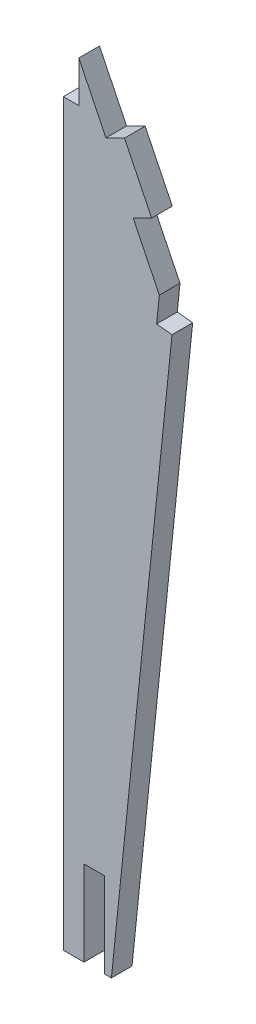
ISO-10303-21;
HEADER;
FILE_DESCRIPTION(('STEP AP214'),'2;1');
FILE_NAME('part.step','',(''),(''),'','','');
FILE_SCHEMA(('AUTOMOTIVE_DESIGN { 1 0 10303 214 1 1 1 1 }'));
ENDSEC;
DATA;
#1=APPLICATION_CONTEXT('core data for automotive mechanical design processes');
#2=APPLICATION_PROTOCOL_DEFINITION('international standard','automotive_design',2000,#1);
#3=PRODUCT_CONTEXT('',#1,'mechanical');
#4=PRODUCT('Part','Part','',(#3));
#5=PRODUCT_RELATED_PRODUCT_CATEGORY('part','',(#4));
#6=PRODUCT_DEFINITION_FORMATION('','',#4);
#7=PRODUCT_DEFINITION_CONTEXT('part definition',#1,'design');
#8=PRODUCT_DEFINITION('design','',#6,#7);
#9=PRODUCT_DEFINITION_SHAPE('','',#8);
#10=(LENGTH_UNIT() NAMED_UNIT(*) SI_UNIT(.MILLI.,.METRE.));
#11=(NAMED_UNIT(*) PLANE_ANGLE_UNIT() SI_UNIT($,.RADIAN.));
#12=(NAMED_UNIT(*) SI_UNIT($,.STERADIAN.) SOLID_ANGLE_UNIT());
#13=UNCERTAINTY_MEASURE_WITH_UNIT(LENGTH_MEASURE(1.E-05),#10,'distance_accuracy_value','');
#14=(GEOMETRIC_REPRESENTATION_CONTEXT(3) GLOBAL_UNCERTAINTY_ASSIGNED_CONTEXT((#13)) GLOBAL_UNIT_ASSIGNED_CONTEXT((#10,
#11,#12)) REPRESENTATION_CONTEXT('',''));
#15=CARTESIAN_POINT('',(0.,0.,0.));
#16=DIRECTION('',(0.,0.,1.));
#17=DIRECTION('',(1.,0.,0.));
#18=AXIS2_PLACEMENT_3D('',#15,#16,#17);
#19=CARTESIAN_POINT('',(6.4460614654401,62.4417438594003,2.));
#20=DIRECTION('',(0.102687481920299,0.994713667874765,0.));
#21=DIRECTION('',(-0.994713667874765,0.102687481920299,0.));
#22=AXIS2_PLACEMENT_3D('',#19,#20,#21);
#23=PLANE('',#22);
#24=DIRECTION('',(0.994713667874765,-0.102687481920299,0.));
#25=VECTOR('',#24,1.);
#26=CARTESIAN_POINT('',(6.4460614654401,62.4417438594003,0.));
#27=LINE('',#26,#25);
#28=CARTESIAN_POINT('',(18.4976497469624,61.1976197523959,0.));
#29=VERTEX_POINT('',#28);
#30=CARTESIAN_POINT('',(19.9897202487737,61.0435885295156,0.));
#31=VERTEX_POINT('',#30);
#32=EDGE_CURVE('E178',#29,#31,#27,.T.);
#33=ORIENTED_EDGE('',*,*,#32,.F.);
#34=DIRECTION('',(0.,0.,-1.));
#35=VECTOR('',#34,1.);
#36=CARTESIAN_POINT('',(18.4976497469624,61.1976197523959,2.));
#37=LINE('',#36,#35);
#38=CARTESIAN_POINT('',(18.4976497469624,61.1976197523959,2.));
#39=VERTEX_POINT('',#38);
#40=EDGE_CURVE('E11',#39,#29,#37,.T.);
#41=ORIENTED_EDGE('',*,*,#40,.F.);
#42=DIRECTION('',(0.994713667874765,-0.102687481920299,0.));
#43=VECTOR('',#42,1.);
#44=CARTESIAN_POINT('',(6.4460614654401,62.4417438594003,2.));
#45=LINE('',#44,#43);
#46=CARTESIAN_POINT('',(19.9897202487737,61.0435885295156,2.));
#47=VERTEX_POINT('',#46);
#48=EDGE_CURVE('E216',#39,#47,#45,.T.);
#49=ORIENTED_EDGE('',*,*,#48,.T.);
#50=DIRECTION('',(0.,0.,-1.));
#51=VECTOR('',#50,1.);
#52=CARTESIAN_POINT('',(19.9897202487737,61.0435885295156,2.));
#53=LINE('',#52,#51);
#54=EDGE_CURVE('E53',#47,#31,#53,.T.);
#55=ORIENTED_EDGE('',*,*,#54,.T.);
#56=EDGE_LOOP('',(#33,#41,#49,#55));
#57=FACE_BOUND('',#56,.T.);
#58=ADVANCED_FACE('F37',(#57),#23,.T.);
#59=CARTESIAN_POINT('',(12.0515882815053,-1.24412410700585,2.));
#60=DIRECTION('',(0.994713667874737,-0.102687481920566,0.));
#61=DIRECTION('',(0.102687481920566,0.994713667874737,0.));
#62=AXIS2_PLACEMENT_3D('',#59,#60,#61);
#63=PLANE('',#62);
#64=DIRECTION('',(-0.102687481920566,-0.994713667874737,0.));
#65=VECTOR('',#64,1.);
#66=CARTESIAN_POINT('',(12.0515882815053,-1.24412410700585,0.));
#67=LINE('',#66,#65);
#68=CARTESIAN_POINT('',(18.76120251057,63.750604120728,0.));
#69=VERTEX_POINT('',#68);
#70=EDGE_CURVE('E180',#69,#29,#67,.T.);
#71=ORIENTED_EDGE('',*,*,#70,.F.);
#72=DIRECTION('',(0.,0.,-1.));
#73=VECTOR('',#72,1.);
#74=CARTESIAN_POINT('',(18.76120251057,63.750604120728,2.));
#75=LINE('',#74,#73);
#76=CARTESIAN_POINT('',(18.76120251057,63.750604120728,2.));
#77=VERTEX_POINT('',#76);
#78=EDGE_CURVE('E45',#77,#69,#75,.T.);
#79=ORIENTED_EDGE('',*,*,#78,.F.);
#80=DIRECTION('',(-0.102687481920566,-0.994713667874737,0.));
#81=VECTOR('',#80,1.);
#82=CARTESIAN_POINT('',(12.0515882815053,-1.24412410700585,2.));
#83=LINE('',#82,#81);
#84=EDGE_CURVE('E266',#77,#39,#83,.T.);
#85=ORIENTED_EDGE('',*,*,#84,.T.);
#86=ORIENTED_EDGE('',*,*,#40,.T.);
#87=EDGE_LOOP('',(#71,#79,#85,#86));
#88=FACE_BOUND('',#87,.T.);
#89=ADVANCED_FACE('F254',(#88),#63,.T.);
#90=CARTESIAN_POINT('',(40.2739568593365,19.6429212262123,2.));
#91=DIRECTION('',(0.898794046339454,0.438371146706477,0.));
#92=DIRECTION('',(-0.438371146706477,0.898794046339454,0.));
#93=AXIS2_PLACEMENT_3D('',#90,#91,#92);
#94=PLANE('',#93);
#95=DIRECTION('',(0.438371146706477,-0.898794046339454,0.));
#96=VECTOR('',#95,1.);
#97=CARTESIAN_POINT('',(40.2739568593365,19.6429212262123,0.));
#98=LINE('',#97,#96);
#99=CARTESIAN_POINT('',(16.2182304213457,68.9644695655097,0.));
#100=VERTEX_POINT('',#99);
#101=EDGE_CURVE('E183',#100,#69,#98,.T.);
#102=ORIENTED_EDGE('',*,*,#101,.F.);
#103=DIRECTION('',(0.,0.,-1.));
#104=VECTOR('',#103,1.);
#105=CARTESIAN_POINT('',(16.2182304213457,68.9644695655097,2.));
#106=LINE('',#105,#104);
#107=CARTESIAN_POINT('',(16.2182304213457,68.9644695655097,2.));
#108=VERTEX_POINT('',#107);
#109=EDGE_CURVE('E243',#108,#100,#106,.T.);
#110=ORIENTED_EDGE('',*,*,#109,.F.);
#111=DIRECTION('',(0.438371146706477,-0.898794046339454,0.));
#112=VECTOR('',#111,1.);
#113=CARTESIAN_POINT('',(40.2739568593365,19.6429212262123,2.));
#114=LINE('',#113,#112);
#115=EDGE_CURVE('E250',#108,#77,#114,.T.);
#116=ORIENTED_EDGE('',*,*,#115,.T.);
#117=ORIENTED_EDGE('',*,*,#78,.T.);
#118=EDGE_LOOP('',(#102,#110,#116,#117));
#119=FACE_BOUND('',#118,.T.);
#120=ADVANCED_FACE('F248',(#119),#94,.T.);
#121=CARTESIAN_POINT('',(-24.0557264407135,49.3215483333959,2.));
#122=DIRECTION('',(0.438371146788932,-0.898794046299238,0.));
#123=DIRECTION('',(0.898794046299238,0.438371146788932,0.));
#124=AXIS2_PLACEMENT_3D('',#121,#122,#123);
#125=PLANE('',#124);
#126=DIRECTION('',(-0.898794046299238,-0.438371146788932,0.));
#127=VECTOR('',#126,1.);
#128=CARTESIAN_POINT('',(-24.0557264407135,49.3215483333959,0.));
#129=LINE('',#128,#127);
#130=CARTESIAN_POINT('',(18.0158185134633,69.8412118588531,0.));
#131=VERTEX_POINT('',#130);
#132=EDGE_CURVE('E186',#131,#100,#129,.T.);
#133=ORIENTED_EDGE('',*,*,#132,.F.);
#134=DIRECTION('',(0.,0.,-1.));
#135=VECTOR('',#134,1.);
#136=CARTESIAN_POINT('',(18.0158185134633,69.8412118588531,2.));
#137=LINE('',#136,#135);
#138=CARTESIAN_POINT('',(18.0158185134633,69.8412118588531,2.));
#139=VERTEX_POINT('',#138);
#140=EDGE_CURVE('E241',#139,#131,#137,.T.);
#141=ORIENTED_EDGE('',*,*,#140,.F.);
#142=DIRECTION('',(-0.898794046299238,-0.438371146788932,0.));
#143=VECTOR('',#142,1.);
#144=CARTESIAN_POINT('',(-24.0557264407135,49.3215483333959,2.));
#145=LINE('',#144,#143);
#146=EDGE_CURVE('E263',#139,#108,#145,.T.);
#147=ORIENTED_EDGE('',*,*,#146,.T.);
#148=ORIENTED_EDGE('',*,*,#109,.T.);
#149=EDGE_LOOP('',(#133,#141,#147,#148));
#150=FACE_BOUND('',#149,.T.);
#151=ADVANCED_FACE('F260',(#150),#125,.T.);
#152=CARTESIAN_POINT('',(42.0715449541826,20.5196635254705,2.));
#153=DIRECTION('',(0.89879404629915,0.438371146789113,0.));
#154=DIRECTION('',(-0.438371146789113,0.89879404629915,0.));
#155=AXIS2_PLACEMENT_3D('',#152,#153,#154);
#156=PLANE('',#155);
#157=DIRECTION('',(0.438371146789113,-0.89879404629915,0.));
#158=VECTOR('',#157,1.);
#159=CARTESIAN_POINT('',(42.0715449541826,20.5196635254705,0.));
#160=LINE('',#159,#158);
#161=CARTESIAN_POINT('',(15.3855916327284,75.2339761366484,0.));
#162=VERTEX_POINT('',#161);
#163=EDGE_CURVE('E189',#162,#131,#160,.T.);
#164=ORIENTED_EDGE('',*,*,#163,.F.);
#165=DIRECTION('',(0.,0.,-1.));
#166=VECTOR('',#165,1.);
#167=CARTESIAN_POINT('',(15.3855916327284,75.2339761366484,2.));
#168=LINE('',#167,#166);
#169=CARTESIAN_POINT('',(15.3855916327284,75.2339761366484,2.));
#170=VERTEX_POINT('',#169);
#171=EDGE_CURVE('E239',#170,#162,#168,.T.);
#172=ORIENTED_EDGE('',*,*,#171,.F.);
#173=DIRECTION('',(0.438371146789113,-0.89879404629915,0.));
#174=VECTOR('',#173,1.);
#175=CARTESIAN_POINT('',(42.0715449541826,20.5196635254705,2.));
#176=LINE('',#175,#174);
#177=EDGE_CURVE('E268',#170,#139,#176,.T.);
#178=ORIENTED_EDGE('',*,*,#177,.T.);
#179=ORIENTED_EDGE('',*,*,#140,.T.);
#180=EDGE_LOOP('',(#164,#172,#178,#179));
#181=FACE_BOUND('',#180,.T.);
#182=ADVANCED_FACE('F320',(#181),#156,.T.);
#183=CARTESIAN_POINT('',(-26.6859533214473,54.7143126111917,2.));
#184=DIRECTION('',(-0.438371146788932,0.898794046299238,0.));
#185=DIRECTION('',(-0.898794046299238,-0.438371146788932,0.));
#186=AXIS2_PLACEMENT_3D('',#183,#184,#185);
#187=PLANE('',#186);
#188=DIRECTION('',(0.898794046299238,0.438371146788932,0.));
#189=VECTOR('',#188,1.);
#190=CARTESIAN_POINT('',(-26.6859533214473,54.7143126111917,0.));
#191=LINE('',#190,#189);
#192=CARTESIAN_POINT('',(13.5880035406108,74.357233843305,0.));
#193=VERTEX_POINT('',#192);
#194=EDGE_CURVE('E192',#193,#162,#191,.T.);
#195=ORIENTED_EDGE('',*,*,#194,.F.);
#196=DIRECTION('',(0.,0.,-1.));
#197=VECTOR('',#196,1.);
#198=CARTESIAN_POINT('',(13.5880035406108,74.357233843305,2.));
#199=LINE('',#198,#197);
#200=CARTESIAN_POINT('',(13.5880035406108,74.357233843305,2.));
#201=VERTEX_POINT('',#200);
#202=EDGE_CURVE('E237',#201,#193,#199,.T.);
#203=ORIENTED_EDGE('',*,*,#202,.F.);
#204=DIRECTION('',(0.898794046299238,0.438371146788932,0.));
#205=VECTOR('',#204,1.);
#206=CARTESIAN_POINT('',(-26.6859533214473,54.7143126111917,2.));
#207=LINE('',#206,#205);
#208=EDGE_CURVE('E274',#201,#170,#207,.T.);
#209=ORIENTED_EDGE('',*,*,#208,.T.);
#210=ORIENTED_EDGE('',*,*,#171,.T.);
#211=EDGE_LOOP('',(#195,#203,#209,#210));
#212=FACE_BOUND('',#211,.T.);
#213=ADVANCED_FACE('F323',(#212),#187,.T.);
#214=CARTESIAN_POINT('',(40.2739568651952,19.6429212381029,2.));
#215=DIRECTION('',(0.898794046260026,0.438371146869329,0.));
#216=DIRECTION('',(-0.438371146869329,0.898794046260026,0.));
#217=AXIS2_PLACEMENT_3D('',#214,#215,#216);
#218=PLANE('',#217);
#219=DIRECTION('',(0.438371146869329,-0.898794046260026,0.));
#220=VECTOR('',#219,1.);
#221=CARTESIAN_POINT('',(40.2739568651952,19.6429212381029,0.));
#222=LINE('',#221,#220);
#223=CARTESIAN_POINT('',(10.9577766593948,79.7499981208653,0.));
#224=VERTEX_POINT('',#223);
#225=EDGE_CURVE('E195',#224,#193,#222,.T.);
#226=ORIENTED_EDGE('',*,*,#225,.F.);
#227=DIRECTION('',(0.,0.,-1.));
#228=VECTOR('',#227,1.);
#229=CARTESIAN_POINT('',(10.9577766593948,79.7499981208653,2.));
#230=LINE('',#229,#228);
#231=CARTESIAN_POINT('',(10.9577766593948,79.7499981208653,2.));
#232=VERTEX_POINT('',#231);
#233=EDGE_CURVE('E235',#232,#224,#230,.T.);
#234=ORIENTED_EDGE('',*,*,#233,.F.);
#235=DIRECTION('',(0.438371146869329,-0.898794046260026,0.));
#236=VECTOR('',#235,1.);
#237=CARTESIAN_POINT('',(40.2739568651952,19.6429212381029,2.));
#238=LINE('',#237,#236);
#239=EDGE_CURVE('E277',#232,#201,#238,.T.);
#240=ORIENTED_EDGE('',*,*,#239,.T.);
#241=ORIENTED_EDGE('',*,*,#202,.T.);
#242=EDGE_LOOP('',(#226,#234,#240,#241));
#243=FACE_BOUND('',#242,.T.);
#244=ADVANCED_FACE('F327',(#243),#218,.T.);
#245=CARTESIAN_POINT('',(10.9577766593948,0.,2.));
#246=DIRECTION('',(1.,0.,0.));
#247=DIRECTION('',(0.,0.,-1.));
#248=AXIS2_PLACEMENT_3D('',#245,#246,#247);
#249=PLANE('',#248);
#250=DIRECTION('',(0.,-1.,0.));
#251=VECTOR('',#250,1.);
#252=CARTESIAN_POINT('',(10.9577766593948,0.,0.));
#253=LINE('',#252,#251);
#254=CARTESIAN_POINT('',(10.9577766593948,75.7499981208653,0.));
#255=VERTEX_POINT('',#254);
#256=EDGE_CURVE('E198',#224,#255,#253,.T.);
#257=ORIENTED_EDGE('',*,*,#256,.T.);
#258=DIRECTION('',(0.,0.,-1.));
#259=VECTOR('',#258,1.);
#260=CARTESIAN_POINT('',(10.9577766593948,75.7499981208653,2.));
#261=LINE('',#260,#259);
#262=CARTESIAN_POINT('',(10.9577766593948,75.7499981208653,2.));
#263=VERTEX_POINT('',#262);
#264=EDGE_CURVE('E232',#263,#255,#261,.T.);
#265=ORIENTED_EDGE('',*,*,#264,.F.);
#266=DIRECTION('',(0.,-1.,0.));
#267=VECTOR('',#266,1.);
#268=CARTESIAN_POINT('',(10.9577766593948,0.,2.));
#269=LINE('',#268,#267);
#270=EDGE_CURVE('E280',#232,#263,#269,.T.);
#271=ORIENTED_EDGE('',*,*,#270,.F.);
#272=ORIENTED_EDGE('',*,*,#233,.T.);
#273=EDGE_LOOP('',(#257,#265,#271,#272));
#274=FACE_BOUND('',#273,.T.);
#275=ADVANCED_FACE('F331',(#274),#249,.F.);
#276=CARTESIAN_POINT('',(0.,75.7499981208653,2.));
#277=DIRECTION('',(0.,-1.,0.));
#278=DIRECTION('',(0.,0.,-1.));
#279=AXIS2_PLACEMENT_3D('',#276,#277,#278);
#280=PLANE('',#279);
#281=DIRECTION('',(-1.,0.,0.));
#282=VECTOR('',#281,1.);
#283=CARTESIAN_POINT('',(0.,75.7499981208653,0.));
#284=LINE('',#283,#282);
#285=CARTESIAN_POINT('',(9.45777665939477,75.7499981208653,0.));
#286=VERTEX_POINT('',#285);
#287=EDGE_CURVE('E200',#255,#286,#284,.T.);
#288=ORIENTED_EDGE('',*,*,#287,.T.);
#289=DIRECTION('',(0.,0.,-1.));
#290=VECTOR('',#289,1.);
#291=CARTESIAN_POINT('',(9.45777665939477,75.7499981208653,2.));
#292=LINE('',#291,#290);
#293=CARTESIAN_POINT('',(9.45777665939477,75.7499981208653,2.));
#294=VERTEX_POINT('',#293);
#295=EDGE_CURVE('E229',#294,#286,#292,.T.);
#296=ORIENTED_EDGE('',*,*,#295,.F.);
#297=DIRECTION('',(-1.,0.,0.));
#298=VECTOR('',#297,1.);
#299=CARTESIAN_POINT('',(0.,75.7499981208653,2.));
#300=LINE('',#299,#298);
#301=EDGE_CURVE('E282',#263,#294,#300,.T.);
#302=ORIENTED_EDGE('',*,*,#301,.F.);
#303=ORIENTED_EDGE('',*,*,#264,.T.);
#304=EDGE_LOOP('',(#288,#296,#302,#303));
#305=FACE_BOUND('',#304,.T.);
#306=ADVANCED_FACE('F335',(#305),#280,.F.);
#307=CARTESIAN_POINT('',(9.45777665939477,0.,2.));
#308=DIRECTION('',(1.,0.,0.));
#309=DIRECTION('',(0.,0.,-1.));
#310=AXIS2_PLACEMENT_3D('',#307,#308,#309);
#311=PLANE('',#310);
#312=DIRECTION('',(0.,-1.,0.));
#313=VECTOR('',#312,1.);
#314=CARTESIAN_POINT('',(9.45777665939477,0.,0.));
#315=LINE('',#314,#313);
#316=CARTESIAN_POINT('',(9.45777665939477,4.12734925013046,0.));
#317=VERTEX_POINT('',#316);
#318=EDGE_CURVE('E202',#286,#317,#315,.T.);
#319=ORIENTED_EDGE('',*,*,#318,.T.);
#320=DIRECTION('',(0.,0.,-1.));
#321=VECTOR('',#320,1.);
#322=CARTESIAN_POINT('',(9.45777665939477,4.12734925013046,2.));
#323=LINE('',#322,#321);
#324=CARTESIAN_POINT('',(9.45777665939477,4.12734925013046,2.));
#325=VERTEX_POINT('',#324);
#326=EDGE_CURVE('E226',#325,#317,#323,.T.);
#327=ORIENTED_EDGE('',*,*,#326,.F.);
#328=DIRECTION('',(0.,-1.,0.));
#329=VECTOR('',#328,1.);
#330=CARTESIAN_POINT('',(9.45777665939477,0.,2.));
#331=LINE('',#330,#329);
#332=EDGE_CURVE('E284',#294,#325,#331,.T.);
#333=ORIENTED_EDGE('',*,*,#332,.F.);
#334=ORIENTED_EDGE('',*,*,#295,.T.);
#335=EDGE_LOOP('',(#319,#327,#333,#334));
#336=FACE_BOUND('',#335,.T.);
#337=ADVANCED_FACE('F339',(#336),#311,.F.);
#338=CARTESIAN_POINT('',(0.,4.12734925013046,2.));
#339=DIRECTION('',(0.,1.,0.));
#340=DIRECTION('',(0.,0.,1.));
#341=AXIS2_PLACEMENT_3D('',#338,#339,#340);
#342=PLANE('',#341);
#343=DIRECTION('',(1.,0.,0.));
#344=VECTOR('',#343,1.);
#345=CARTESIAN_POINT('',(0.,4.12734925013046,0.));
#346=LINE('',#345,#344);
#347=CARTESIAN_POINT('',(11.4577766593957,4.12734925013046,0.));
#348=VERTEX_POINT('',#347);
#349=EDGE_CURVE('E204',#317,#348,#346,.T.);
#350=ORIENTED_EDGE('',*,*,#349,.T.);
#351=DIRECTION('',(0.,0.,-1.));
#352=VECTOR('',#351,1.);
#353=CARTESIAN_POINT('',(11.4577766593957,4.12734925013046,2.));
#354=LINE('',#353,#352);
#355=CARTESIAN_POINT('',(11.4577766593957,4.12734925013046,2.));
#356=VERTEX_POINT('',#355);
#357=EDGE_CURVE('E223',#356,#348,#354,.T.);
#358=ORIENTED_EDGE('',*,*,#357,.F.);
#359=DIRECTION('',(1.,0.,0.));
#360=VECTOR('',#359,1.);
#361=CARTESIAN_POINT('',(0.,4.12734925013046,2.));
#362=LINE('',#361,#360);
#363=EDGE_CURVE('E286',#325,#356,#362,.T.);
#364=ORIENTED_EDGE('',*,*,#363,.F.);
#365=ORIENTED_EDGE('',*,*,#326,.T.);
#366=EDGE_LOOP('',(#350,#358,#364,#365));
#367=FACE_BOUND('',#366,.T.);
#368=ADVANCED_FACE('F343',(#367),#342,.F.);
#369=CARTESIAN_POINT('',(11.4577766593957,0.,2.));
#370=DIRECTION('',(-1.,0.,0.));
#371=DIRECTION('',(0.,0.,1.));
#372=AXIS2_PLACEMENT_3D('',#369,#370,#371);
#373=PLANE('',#372);
#374=DIRECTION('',(0.,1.,0.));
#375=VECTOR('',#374,1.);
#376=CARTESIAN_POINT('',(11.4577766593957,0.,0.));
#377=LINE('',#376,#375);
#378=CARTESIAN_POINT('',(11.4577766593957,12.3773492501414,0.));
#379=VERTEX_POINT('',#378);
#380=EDGE_CURVE('E206',#348,#379,#377,.T.);
#381=ORIENTED_EDGE('',*,*,#380,.T.);
#382=DIRECTION('',(0.,0.,-1.));
#383=VECTOR('',#382,1.);
#384=CARTESIAN_POINT('',(11.4577766593957,12.3773492501414,2.));
#385=LINE('',#384,#383);
#386=CARTESIAN_POINT('',(11.4577766593957,12.3773492501414,2.));
#387=VERTEX_POINT('',#386);
#388=EDGE_CURVE('E220',#387,#379,#385,.T.);
#389=ORIENTED_EDGE('',*,*,#388,.F.);
#390=DIRECTION('',(0.,1.,0.));
#391=VECTOR('',#390,1.);
#392=CARTESIAN_POINT('',(11.4577766593957,0.,2.));
#393=LINE('',#392,#391);
#394=EDGE_CURVE('E288',#356,#387,#393,.T.);
#395=ORIENTED_EDGE('',*,*,#394,.F.);
#396=ORIENTED_EDGE('',*,*,#357,.T.);
#397=EDGE_LOOP('',(#381,#389,#395,#396));
#398=FACE_BOUND('',#397,.T.);
#399=ADVANCED_FACE('F294',(#398),#373,.F.);
#400=CARTESIAN_POINT('',(0.,12.3773492501414,2.));
#401=DIRECTION('',(0.,1.,0.));
#402=DIRECTION('',(0.,0.,1.));
#403=AXIS2_PLACEMENT_3D('',#400,#401,#402);
#404=PLANE('',#403);
#405=DIRECTION('',(1.,0.,0.));
#406=VECTOR('',#405,1.);
#407=CARTESIAN_POINT('',(0.,12.3773492501414,0.));
#408=LINE('',#407,#406);
#409=CARTESIAN_POINT('',(13.4577766593957,12.3773492501414,0.));
#410=VERTEX_POINT('',#409);
#411=EDGE_CURVE('E208',#379,#410,#408,.T.);
#412=ORIENTED_EDGE('',*,*,#411,.T.);
#413=DIRECTION('',(0.,0.,-1.));
#414=VECTOR('',#413,1.);
#415=CARTESIAN_POINT('',(13.4577766593957,12.3773492501414,2.));
#416=LINE('',#415,#414);
#417=CARTESIAN_POINT('',(13.4577766593957,12.3773492501414,2.));
#418=VERTEX_POINT('',#417);
#419=EDGE_CURVE('E170',#418,#410,#416,.T.);
#420=ORIENTED_EDGE('',*,*,#419,.F.);
#421=DIRECTION('',(1.,0.,0.));
#422=VECTOR('',#421,1.);
#423=CARTESIAN_POINT('',(0.,12.3773492501414,2.));
#424=LINE('',#423,#422);
#425=EDGE_CURVE('E158',#387,#418,#424,.T.);
#426=ORIENTED_EDGE('',*,*,#425,.F.);
#427=ORIENTED_EDGE('',*,*,#388,.T.);
#428=EDGE_LOOP('',(#412,#420,#426,#427));
#429=FACE_BOUND('',#428,.T.);
#430=ADVANCED_FACE('F298',(#429),#404,.F.);
#431=CARTESIAN_POINT('',(13.4577766593957,0.,2.));
#432=DIRECTION('',(1.,0.,0.));
#433=DIRECTION('',(0.,0.,-1.));
#434=AXIS2_PLACEMENT_3D('',#431,#432,#433);
#435=PLANE('',#434);
#436=DIRECTION('',(0.,-1.,0.));
#437=VECTOR('',#436,1.);
#438=CARTESIAN_POINT('',(13.4577766593957,0.,0.));
#439=LINE('',#438,#437);
#440=CARTESIAN_POINT('',(13.4577766593957,4.12734925013046,0.));
#441=VERTEX_POINT('',#440);
#442=EDGE_CURVE('E167',#410,#441,#439,.T.);
#443=ORIENTED_EDGE('',*,*,#442,.T.);
#444=DIRECTION('',(0.,0.,-1.));
#445=VECTOR('',#444,1.);
#446=CARTESIAN_POINT('',(13.4577766593957,4.12734925013046,2.));
#447=LINE('',#446,#445);
#448=CARTESIAN_POINT('',(13.4577766593957,4.12734925013046,2.));
#449=VERTEX_POINT('',#448);
#450=EDGE_CURVE('E164',#449,#441,#447,.T.);
#451=ORIENTED_EDGE('',*,*,#450,.F.);
#452=DIRECTION('',(0.,-1.,0.));
#453=VECTOR('',#452,1.);
#454=CARTESIAN_POINT('',(13.4577766593957,0.,2.));
#455=LINE('',#454,#453);
#456=EDGE_CURVE('E151',#418,#449,#455,.T.);
#457=ORIENTED_EDGE('',*,*,#456,.F.);
#458=ORIENTED_EDGE('',*,*,#419,.T.);
#459=EDGE_LOOP('',(#443,#451,#457,#458));
#460=FACE_BOUND('',#459,.T.);
#461=ADVANCED_FACE('F165',(#460),#435,.F.);
#462=CARTESIAN_POINT('',(0.,4.12734925013046,2.));
#463=DIRECTION('',(0.,1.,0.));
#464=DIRECTION('',(0.,0.,1.));
#465=AXIS2_PLACEMENT_3D('',#462,#463,#464);
#466=PLANE('',#465);
#467=DIRECTION('',(1.,0.,0.));
#468=VECTOR('',#467,1.);
#469=CARTESIAN_POINT('',(0.,4.12734925013046,0.));
#470=LINE('',#469,#468);
#471=CARTESIAN_POINT('',(14.1140743410688,4.12734925013046,0.));
#472=VERTEX_POINT('',#471);
#473=EDGE_CURVE('E211',#441,#472,#470,.T.);
#474=ORIENTED_EDGE('',*,*,#473,.T.);
#475=DIRECTION('',(0.,0.,-1.));
#476=VECTOR('',#475,1.);
#477=CARTESIAN_POINT('',(14.1140743410688,4.12734925013046,2.));
#478=LINE('',#477,#476);
#479=CARTESIAN_POINT('',(14.1140743410688,4.12734925013046,2.));
#480=VERTEX_POINT('',#479);
#481=EDGE_CURVE('E103',#480,#472,#478,.T.);
#482=ORIENTED_EDGE('',*,*,#481,.F.);
#483=DIRECTION('',(1.,0.,0.));
#484=VECTOR('',#483,1.);
#485=CARTESIAN_POINT('',(0.,4.12734925013046,2.));
#486=LINE('',#485,#484);
#487=EDGE_CURVE('E156',#449,#480,#486,.T.);
#488=ORIENTED_EDGE('',*,*,#487,.F.);
#489=ORIENTED_EDGE('',*,*,#450,.T.);
#490=EDGE_LOOP('',(#474,#482,#488,#489));
#491=FACE_BOUND('',#490,.T.);
#492=ADVANCED_FACE('F172',(#491),#466,.F.);
#493=CARTESIAN_POINT('',(13.5436587833188,-1.39815532988634,2.));
#494=DIRECTION('',(0.994713667874741,-0.102687481920529,0.));
#495=DIRECTION('',(0.102687481920529,0.994713667874741,0.));
#496=AXIS2_PLACEMENT_3D('',#493,#494,#495);
#497=PLANE('',#496);
#498=DIRECTION('',(-0.102687481920529,-0.994713667874741,0.));
#499=VECTOR('',#498,1.);
#500=CARTESIAN_POINT('',(13.5436587833188,-1.39815532988634,0.));
#501=LINE('',#500,#499);
#502=EDGE_CURVE('E213',#31,#472,#501,.T.);
#503=ORIENTED_EDGE('',*,*,#502,.F.);
#504=ORIENTED_EDGE('',*,*,#54,.F.);
#505=DIRECTION('',(-0.102687481920529,-0.994713667874741,0.));
#506=VECTOR('',#505,1.);
#507=CARTESIAN_POINT('',(13.5436587833188,-1.39815532988634,2.));
#508=LINE('',#507,#506);
#509=EDGE_CURVE('E173',#47,#480,#508,.T.);
#510=ORIENTED_EDGE('',*,*,#509,.T.);
#511=ORIENTED_EDGE('',*,*,#481,.T.);
#512=EDGE_LOOP('',(#503,#504,#510,#511));
#513=FACE_BOUND('',#512,.T.);
#514=ADVANCED_FACE('F299',(#513),#497,.T.);
#515=CARTESIAN_POINT('',(0.,0.,2.));
#516=DIRECTION('',(0.,0.,1.));
#517=DIRECTION('',(1.,0.,0.));
#518=AXIS2_PLACEMENT_3D('',#515,#516,#517);
#519=PLANE('',#518);
#520=ORIENTED_EDGE('',*,*,#48,.F.);
#521=ORIENTED_EDGE('',*,*,#84,.F.);
#522=ORIENTED_EDGE('',*,*,#115,.F.);
#523=ORIENTED_EDGE('',*,*,#146,.F.);
#524=ORIENTED_EDGE('',*,*,#177,.F.);
#525=ORIENTED_EDGE('',*,*,#208,.F.);
#526=ORIENTED_EDGE('',*,*,#239,.F.);
#527=ORIENTED_EDGE('',*,*,#270,.T.);
#528=ORIENTED_EDGE('',*,*,#301,.T.);
#529=ORIENTED_EDGE('',*,*,#332,.T.);
#530=ORIENTED_EDGE('',*,*,#363,.T.);
#531=ORIENTED_EDGE('',*,*,#394,.T.);
#532=ORIENTED_EDGE('',*,*,#425,.T.);
#533=ORIENTED_EDGE('',*,*,#456,.T.);
#534=ORIENTED_EDGE('',*,*,#487,.T.);
#535=ORIENTED_EDGE('',*,*,#509,.F.);
#536=EDGE_LOOP('',(#520,#521,#522,#523,#524,#525,#526,#527,#528,#529,#530,#531,#532,#533,#534,#535));
#537=FACE_BOUND('',#536,.T.);
#538=ADVANCED_FACE('F153',(#537),#519,.T.);
#539=CARTESIAN_POINT('',(0.,0.,0.));
#540=DIRECTION('',(0.,0.,1.));
#541=DIRECTION('',(1.,0.,0.));
#542=AXIS2_PLACEMENT_3D('',#539,#540,#541);
#543=PLANE('',#542);
#544=ORIENTED_EDGE('',*,*,#32,.T.);
#545=ORIENTED_EDGE('',*,*,#502,.T.);
#546=ORIENTED_EDGE('',*,*,#473,.F.);
#547=ORIENTED_EDGE('',*,*,#442,.F.);
#548=ORIENTED_EDGE('',*,*,#411,.F.);
#549=ORIENTED_EDGE('',*,*,#380,.F.);
#550=ORIENTED_EDGE('',*,*,#349,.F.);
#551=ORIENTED_EDGE('',*,*,#318,.F.);
#552=ORIENTED_EDGE('',*,*,#287,.F.);
#553=ORIENTED_EDGE('',*,*,#256,.F.);
#554=ORIENTED_EDGE('',*,*,#225,.T.);
#555=ORIENTED_EDGE('',*,*,#194,.T.);
#556=ORIENTED_EDGE('',*,*,#163,.T.);
#557=ORIENTED_EDGE('',*,*,#132,.T.);
#558=ORIENTED_EDGE('',*,*,#101,.T.);
#559=ORIENTED_EDGE('',*,*,#70,.T.);
#560=EDGE_LOOP('',(#544,#545,#546,#547,#548,#549,#550,#551,#552,#553,#554,#555,#556,#557,#558,#559));
#561=FACE_BOUND('',#560,.T.);
#562=ADVANCED_FACE('F256',(#561),#543,.F.);
#563=CLOSED_SHELL('',(#58,#89,#120,#151,#182,#213,#244,#275,#306,#337,#368,#399,#430,#461,#492,
#514,#538,#562));
#564=MANIFOLD_SOLID_BREP('B2',#563);
#565=ADVANCED_BREP_SHAPE_REPRESENTATION('',(#18,#564),#14);
#566=SHAPE_DEFINITION_REPRESENTATION(#9,#565);
ENDSEC;
END-ISO-10303-21;
